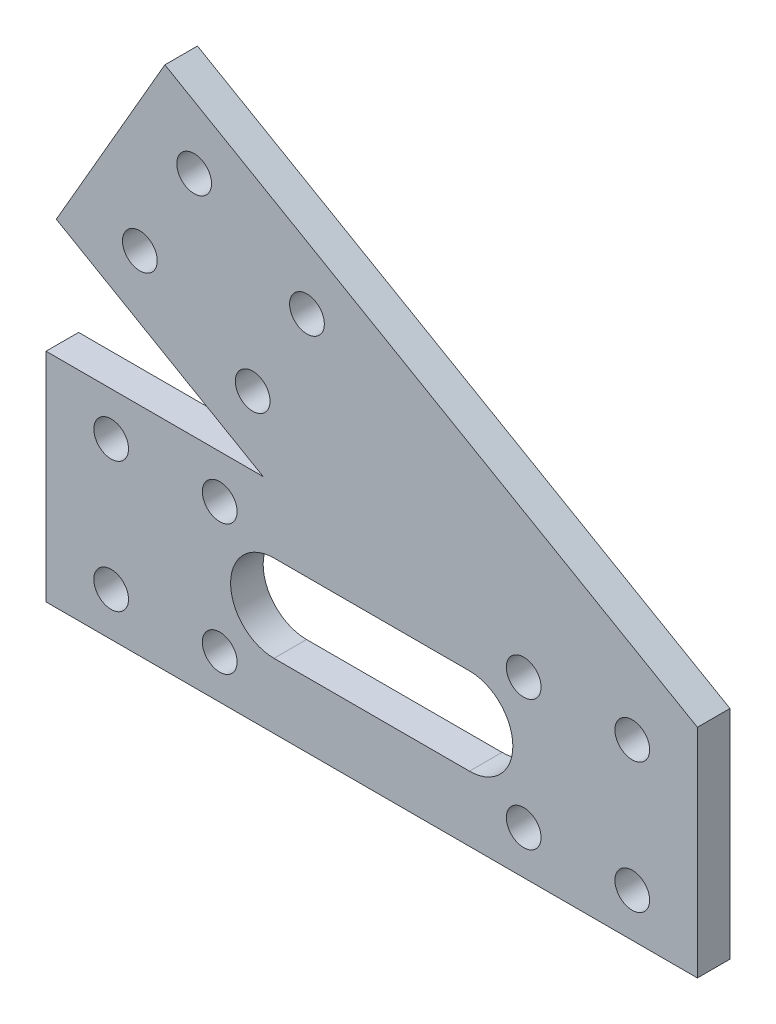
ISO-10303-21;
HEADER;
FILE_DESCRIPTION(('STEP AP214'),'2;1');
FILE_NAME('part.step','',(''),(''),'','','');
FILE_SCHEMA(('AUTOMOTIVE_DESIGN { 1 0 10303 214 1 1 1 1 }'));
ENDSEC;
DATA;
#1=APPLICATION_CONTEXT('core data for automotive mechanical design processes');
#2=APPLICATION_PROTOCOL_DEFINITION('international standard','automotive_design',2000,#1);
#3=PRODUCT_CONTEXT('',#1,'mechanical');
#4=PRODUCT('Part','Part','',(#3));
#5=PRODUCT_RELATED_PRODUCT_CATEGORY('part','',(#4));
#6=PRODUCT_DEFINITION_FORMATION('','',#4);
#7=PRODUCT_DEFINITION_CONTEXT('part definition',#1,'design');
#8=PRODUCT_DEFINITION('design','',#6,#7);
#9=PRODUCT_DEFINITION_SHAPE('','',#8);
#10=(LENGTH_UNIT() NAMED_UNIT(*) SI_UNIT(.MILLI.,.METRE.));
#11=(NAMED_UNIT(*) PLANE_ANGLE_UNIT() SI_UNIT($,.RADIAN.));
#12=(NAMED_UNIT(*) SI_UNIT($,.STERADIAN.) SOLID_ANGLE_UNIT());
#13=UNCERTAINTY_MEASURE_WITH_UNIT(LENGTH_MEASURE(1.E-05),#10,'distance_accuracy_value','');
#14=(GEOMETRIC_REPRESENTATION_CONTEXT(3) GLOBAL_UNCERTAINTY_ASSIGNED_CONTEXT((#13)) GLOBAL_UNIT_ASSIGNED_CONTEXT((#10,
#11,#12)) REPRESENTATION_CONTEXT('',''));
#15=CARTESIAN_POINT('',(0.,0.,0.));
#16=DIRECTION('',(0.,0.,1.));
#17=DIRECTION('',(1.,0.,0.));
#18=AXIS2_PLACEMENT_3D('',#15,#16,#17);
#19=CARTESIAN_POINT('',(60.,20.,3.));
#20=DIRECTION('',(-1.,0.,0.));
#21=DIRECTION('',(0.,0.,1.));
#22=AXIS2_PLACEMENT_3D('',#19,#20,#21);
#23=PLANE('',#22);
#24=DIRECTION('',(0.,1.,0.));
#25=VECTOR('',#24,1.);
#26=CARTESIAN_POINT('',(60.,20.,0.));
#27=LINE('',#26,#25);
#28=CARTESIAN_POINT('',(60.,0.,0.));
#29=VERTEX_POINT('',#28);
#30=CARTESIAN_POINT('',(60.,20.,0.));
#31=VERTEX_POINT('',#30);
#32=EDGE_CURVE('E195',#29,#31,#27,.T.);
#33=ORIENTED_EDGE('',*,*,#32,.T.);
#34=DIRECTION('',(0.,0.,-1.));
#35=VECTOR('',#34,1.);
#36=CARTESIAN_POINT('',(60.,20.,3.));
#37=LINE('',#36,#35);
#38=CARTESIAN_POINT('',(60.,20.,3.));
#39=VERTEX_POINT('',#38);
#40=EDGE_CURVE('E226',#39,#31,#37,.T.);
#41=ORIENTED_EDGE('',*,*,#40,.F.);
#42=DIRECTION('',(0.,1.,0.));
#43=VECTOR('',#42,1.);
#44=CARTESIAN_POINT('',(60.,20.,3.));
#45=LINE('',#44,#43);
#46=CARTESIAN_POINT('',(60.,0.,3.));
#47=VERTEX_POINT('',#46);
#48=EDGE_CURVE('E178',#47,#39,#45,.T.);
#49=ORIENTED_EDGE('',*,*,#48,.F.);
#50=DIRECTION('',(0.,0.,-1.));
#51=VECTOR('',#50,1.);
#52=CARTESIAN_POINT('',(60.,0.,3.));
#53=LINE('',#52,#51);
#54=EDGE_CURVE('E194',#47,#29,#53,.T.);
#55=ORIENTED_EDGE('',*,*,#54,.T.);
#56=EDGE_LOOP('',(#33,#41,#49,#55));
#57=FACE_BOUND('',#56,.T.);
#58=ADVANCED_FACE('F35',(#57),#23,.F.);
#59=CARTESIAN_POINT('',(10.9474411167429,48.3205080756887,3.));
#60=DIRECTION('',(-0.500000000000003,-0.866025403784437,0.));
#61=DIRECTION('',(0.866025403784437,-0.500000000000003,0.));
#62=AXIS2_PLACEMENT_3D('',#59,#60,#61);
#63=PLANE('',#62);
#64=DIRECTION('',(-0.866025403784437,0.500000000000003,0.));
#65=VECTOR('',#64,1.);
#66=CARTESIAN_POINT('',(10.9474411167429,48.3205080756887,0.));
#67=LINE('',#66,#65);
#68=CARTESIAN_POINT('',(10.9474411167429,48.3205080756887,0.));
#69=VERTEX_POINT('',#68);
#70=EDGE_CURVE('E198',#31,#69,#67,.T.);
#71=ORIENTED_EDGE('',*,*,#70,.T.);
#72=DIRECTION('',(0.,0.,-1.));
#73=VECTOR('',#72,1.);
#74=CARTESIAN_POINT('',(10.9474411167429,48.3205080756887,3.));
#75=LINE('',#74,#73);
#76=CARTESIAN_POINT('',(10.9474411167429,48.3205080756887,3.));
#77=VERTEX_POINT('',#76);
#78=EDGE_CURVE('E223',#77,#69,#75,.T.);
#79=ORIENTED_EDGE('',*,*,#78,.F.);
#80=DIRECTION('',(-0.866025403784437,0.500000000000003,0.));
#81=VECTOR('',#80,1.);
#82=CARTESIAN_POINT('',(10.9474411167429,48.3205080756887,3.));
#83=LINE('',#82,#81);
#84=EDGE_CURVE('E181',#39,#77,#83,.T.);
#85=ORIENTED_EDGE('',*,*,#84,.F.);
#86=ORIENTED_EDGE('',*,*,#40,.T.);
#87=EDGE_LOOP('',(#71,#79,#85,#86));
#88=FACE_BOUND('',#87,.T.);
#89=ADVANCED_FACE('F332',(#88),#63,.F.);
#90=CARTESIAN_POINT('',(0.947441116743004,30.9999999999998,3.));
#91=DIRECTION('',(0.866025403784441,-0.499999999999995,0.));
#92=DIRECTION('',(0.499999999999995,0.866025403784442,0.));
#93=AXIS2_PLACEMENT_3D('',#90,#91,#92);
#94=PLANE('',#93);
#95=DIRECTION('',(-0.499999999999995,-0.866025403784442,0.));
#96=VECTOR('',#95,1.);
#97=CARTESIAN_POINT('',(0.947441116743004,30.9999999999998,0.));
#98=LINE('',#97,#96);
#99=CARTESIAN_POINT('',(0.947441116743004,30.9999999999998,0.));
#100=VERTEX_POINT('',#99);
#101=EDGE_CURVE('E200',#69,#100,#98,.T.);
#102=ORIENTED_EDGE('',*,*,#101,.T.);
#103=DIRECTION('',(0.,0.,-1.));
#104=VECTOR('',#103,1.);
#105=CARTESIAN_POINT('',(0.947441116743004,30.9999999999998,3.));
#106=LINE('',#105,#104);
#107=CARTESIAN_POINT('',(0.947441116743004,30.9999999999998,3.));
#108=VERTEX_POINT('',#107);
#109=EDGE_CURVE('E220',#108,#100,#106,.T.);
#110=ORIENTED_EDGE('',*,*,#109,.F.);
#111=DIRECTION('',(-0.499999999999995,-0.866025403784442,0.));
#112=VECTOR('',#111,1.);
#113=CARTESIAN_POINT('',(0.947441116743004,30.9999999999998,3.));
#114=LINE('',#113,#112);
#115=EDGE_CURVE('E184',#77,#108,#114,.T.);
#116=ORIENTED_EDGE('',*,*,#115,.F.);
#117=ORIENTED_EDGE('',*,*,#78,.T.);
#118=EDGE_LOOP('',(#102,#110,#116,#117));
#119=FACE_BOUND('',#118,.T.);
#120=ADVANCED_FACE('F329',(#119),#94,.F.);
#121=CARTESIAN_POINT('',(20.0000000000007,19.9999999999999,3.));
#122=DIRECTION('',(0.499999999999995,0.866025403784441,0.));
#123=DIRECTION('',(-0.866025403784442,0.499999999999995,0.));
#124=AXIS2_PLACEMENT_3D('',#121,#122,#123);
#125=PLANE('',#124);
#126=DIRECTION('',(0.866025403784442,-0.499999999999995,0.));
#127=VECTOR('',#126,1.);
#128=CARTESIAN_POINT('',(20.0000000000007,19.9999999999999,0.));
#129=LINE('',#128,#127);
#130=CARTESIAN_POINT('',(20.0000000000007,19.9999999999999,0.));
#131=VERTEX_POINT('',#130);
#132=EDGE_CURVE('E202',#100,#131,#129,.T.);
#133=ORIENTED_EDGE('',*,*,#132,.T.);
#134=DIRECTION('',(0.,0.,-1.));
#135=VECTOR('',#134,1.);
#136=CARTESIAN_POINT('',(20.0000000000007,19.9999999999999,3.));
#137=LINE('',#136,#135);
#138=CARTESIAN_POINT('',(20.0000000000007,19.9999999999999,3.));
#139=VERTEX_POINT('',#138);
#140=EDGE_CURVE('E217',#139,#131,#137,.T.);
#141=ORIENTED_EDGE('',*,*,#140,.F.);
#142=DIRECTION('',(0.866025403784442,-0.499999999999995,0.));
#143=VECTOR('',#142,1.);
#144=CARTESIAN_POINT('',(20.0000000000007,19.9999999999999,3.));
#145=LINE('',#144,#143);
#146=EDGE_CURVE('E186',#108,#139,#145,.T.);
#147=ORIENTED_EDGE('',*,*,#146,.F.);
#148=ORIENTED_EDGE('',*,*,#109,.T.);
#149=EDGE_LOOP('',(#133,#141,#147,#148));
#150=FACE_BOUND('',#149,.T.);
#151=ADVANCED_FACE('F325',(#150),#125,.F.);
#152=CARTESIAN_POINT('',(20.0000000000007,19.9999999999999,3.));
#153=DIRECTION('',(0.,-1.,0.));
#154=DIRECTION('',(1.,0.,0.));
#155=AXIS2_PLACEMENT_3D('',#152,#153,#154);
#156=PLANE('',#155);
#157=DIRECTION('',(-1.,0.,0.));
#158=VECTOR('',#157,1.);
#159=CARTESIAN_POINT('',(20.0000000000007,19.9999999999999,0.));
#160=LINE('',#159,#158);
#161=CARTESIAN_POINT('',(0.,20.,0.));
#162=VERTEX_POINT('',#161);
#163=EDGE_CURVE('E204',#131,#162,#160,.T.);
#164=ORIENTED_EDGE('',*,*,#163,.T.);
#165=DIRECTION('',(0.,0.,-1.));
#166=VECTOR('',#165,1.);
#167=CARTESIAN_POINT('',(0.,20.,3.));
#168=LINE('',#167,#166);
#169=CARTESIAN_POINT('',(0.,20.,3.));
#170=VERTEX_POINT('',#169);
#171=EDGE_CURVE('E214',#170,#162,#168,.T.);
#172=ORIENTED_EDGE('',*,*,#171,.F.);
#173=DIRECTION('',(-1.,0.,0.));
#174=VECTOR('',#173,1.);
#175=CARTESIAN_POINT('',(20.0000000000007,19.9999999999999,3.));
#176=LINE('',#175,#174);
#177=EDGE_CURVE('E188',#139,#170,#176,.T.);
#178=ORIENTED_EDGE('',*,*,#177,.F.);
#179=ORIENTED_EDGE('',*,*,#140,.T.);
#180=EDGE_LOOP('',(#164,#172,#178,#179));
#181=FACE_BOUND('',#180,.T.);
#182=ADVANCED_FACE('F320',(#181),#156,.F.);
#183=CARTESIAN_POINT('',(0.,0.,3.));
#184=DIRECTION('',(1.,0.,0.));
#185=DIRECTION('',(0.,0.,-1.));
#186=AXIS2_PLACEMENT_3D('',#183,#184,#185);
#187=PLANE('',#186);
#188=DIRECTION('',(0.,-1.,0.));
#189=VECTOR('',#188,1.);
#190=CARTESIAN_POINT('',(0.,0.,0.));
#191=LINE('',#190,#189);
#192=CARTESIAN_POINT('',(0.,0.,0.));
#193=VERTEX_POINT('',#192);
#194=EDGE_CURVE('E206',#162,#193,#191,.T.);
#195=ORIENTED_EDGE('',*,*,#194,.T.);
#196=DIRECTION('',(0.,0.,-1.));
#197=VECTOR('',#196,1.);
#198=CARTESIAN_POINT('',(0.,0.,3.));
#199=LINE('',#198,#197);
#200=CARTESIAN_POINT('',(0.,0.,3.));
#201=VERTEX_POINT('',#200);
#202=EDGE_CURVE('E211',#201,#193,#199,.T.);
#203=ORIENTED_EDGE('',*,*,#202,.F.);
#204=DIRECTION('',(0.,-1.,0.));
#205=VECTOR('',#204,1.);
#206=CARTESIAN_POINT('',(0.,0.,3.));
#207=LINE('',#206,#205);
#208=EDGE_CURVE('E190',#170,#201,#207,.T.);
#209=ORIENTED_EDGE('',*,*,#208,.F.);
#210=ORIENTED_EDGE('',*,*,#171,.T.);
#211=EDGE_LOOP('',(#195,#203,#209,#210));
#212=FACE_BOUND('',#211,.T.);
#213=ADVANCED_FACE('F315',(#212),#187,.F.);
#214=CARTESIAN_POINT('',(60.,0.,3.));
#215=DIRECTION('',(0.,1.,0.));
#216=DIRECTION('',(-1.,0.,0.));
#217=AXIS2_PLACEMENT_3D('',#214,#215,#216);
#218=PLANE('',#217);
#219=DIRECTION('',(1.,0.,0.));
#220=VECTOR('',#219,1.);
#221=CARTESIAN_POINT('',(60.,0.,0.));
#222=LINE('',#221,#220);
#223=EDGE_CURVE('E182',#193,#29,#222,.T.);
#224=ORIENTED_EDGE('',*,*,#223,.T.);
#225=ORIENTED_EDGE('',*,*,#54,.F.);
#226=DIRECTION('',(1.,0.,0.));
#227=VECTOR('',#226,1.);
#228=CARTESIAN_POINT('',(60.,0.,3.));
#229=LINE('',#228,#227);
#230=EDGE_CURVE('E192',#201,#47,#229,.T.);
#231=ORIENTED_EDGE('',*,*,#230,.F.);
#232=ORIENTED_EDGE('',*,*,#202,.T.);
#233=EDGE_LOOP('',(#224,#225,#231,#232));
#234=FACE_BOUND('',#233,.T.);
#235=ADVANCED_FACE('F311',(#234),#218,.F.);
#236=CARTESIAN_POINT('',(0.,0.,3.));
#237=DIRECTION('',(0.,0.,-1.));
#238=DIRECTION('',(-1.,0.,0.));
#239=AXIS2_PLACEMENT_3D('',#236,#237,#238);
#240=PLANE('',#239);
#241=CARTESIAN_POINT('',(13.6435935394494,40.9903810567663,3.));
#242=DIRECTION('',(0.,0.,1.));
#243=DIRECTION('',(1.,0.,0.));
#244=AXIS2_PLACEMENT_3D('',#241,#242,#243);
#245=CIRCLE('',#244,1.6);
#246=CARTESIAN_POINT('',(15.2435935394494,40.9903810567663,3.));
#247=VERTEX_POINT('',#246);
#248=EDGE_CURVE('E169',#247,#247,#245,.T.);
#249=ORIENTED_EDGE('',*,*,#248,.F.);
#250=EDGE_LOOP('',(#249));
#251=FACE_BOUND('',#250,.T.);
#252=CARTESIAN_POINT('',(16.,3.99999999999991,3.));
#253=DIRECTION('',(0.,0.,1.));
#254=DIRECTION('',(1.,0.,0.));
#255=AXIS2_PLACEMENT_3D('',#252,#253,#254);
#256=CIRCLE('',#255,1.6);
#257=CARTESIAN_POINT('',(17.6,3.99999999999991,3.));
#258=VERTEX_POINT('',#257);
#259=EDGE_CURVE('E147',#258,#258,#256,.T.);
#260=ORIENTED_EDGE('',*,*,#259,.F.);
#261=EDGE_LOOP('',(#260));
#262=FACE_BOUND('',#261,.T.);
#263=CARTESIAN_POINT('',(44.,15.9999999999999,3.));
#264=DIRECTION('',(0.,0.,1.));
#265=DIRECTION('',(1.,0.,0.));
#266=AXIS2_PLACEMENT_3D('',#263,#264,#265);
#267=CIRCLE('',#266,1.6);
#268=CARTESIAN_POINT('',(45.6,15.9999999999999,3.));
#269=VERTEX_POINT('',#268);
#270=EDGE_CURVE('E151',#269,#269,#267,.T.);
#271=ORIENTED_EDGE('',*,*,#270,.F.);
#272=EDGE_LOOP('',(#271));
#273=FACE_BOUND('',#272,.T.);
#274=CARTESIAN_POINT('',(44.,3.99999999999991,3.));
#275=DIRECTION('',(0.,0.,1.));
#276=DIRECTION('',(1.,0.,0.));
#277=AXIS2_PLACEMENT_3D('',#274,#275,#276);
#278=CIRCLE('',#277,1.6);
#279=CARTESIAN_POINT('',(45.6,3.99999999999991,3.));
#280=VERTEX_POINT('',#279);
#281=EDGE_CURVE('E144',#280,#280,#278,.T.);
#282=ORIENTED_EDGE('',*,*,#281,.F.);
#283=EDGE_LOOP('',(#282));
#284=FACE_BOUND('',#283,.T.);
#285=DIRECTION('',(1.,0.,0.));
#286=VECTOR('',#285,1.);
#287=CARTESIAN_POINT('',(21.,5.99999999999991,3.));
#288=LINE('',#287,#286);
#289=CARTESIAN_POINT('',(21.,5.99999999999991,3.));
#290=VERTEX_POINT('',#289);
#291=CARTESIAN_POINT('',(39.,5.99999999999991,3.));
#292=VERTEX_POINT('',#291);
#293=EDGE_CURVE('E130',#290,#292,#288,.T.);
#294=ORIENTED_EDGE('',*,*,#293,.F.);
#295=CARTESIAN_POINT('',(21.,9.99999999999991,3.));
#296=DIRECTION('',(0.,0.,1.));
#297=DIRECTION('',(1.,0.,0.));
#298=AXIS2_PLACEMENT_3D('',#295,#296,#297);
#299=CIRCLE('',#298,4.);
#300=CARTESIAN_POINT('',(21.,13.9999999999999,3.));
#301=VERTEX_POINT('',#300);
#302=EDGE_CURVE('E51',#301,#290,#299,.T.);
#303=ORIENTED_EDGE('',*,*,#302,.F.);
#304=DIRECTION('',(-1.,0.,0.));
#305=VECTOR('',#304,1.);
#306=CARTESIAN_POINT('',(21.,13.9999999999999,3.));
#307=LINE('',#306,#305);
#308=CARTESIAN_POINT('',(39.,13.9999999999999,3.));
#309=VERTEX_POINT('',#308);
#310=EDGE_CURVE('E137',#309,#301,#307,.T.);
#311=ORIENTED_EDGE('',*,*,#310,.F.);
#312=CARTESIAN_POINT('',(39.,9.99999999999991,3.));
#313=DIRECTION('',(0.,0.,1.));
#314=DIRECTION('',(1.,0.,0.));
#315=AXIS2_PLACEMENT_3D('',#312,#313,#314);
#316=CIRCLE('',#315,4.);
#317=EDGE_CURVE('E121',#292,#309,#316,.T.);
#318=ORIENTED_EDGE('',*,*,#317,.F.);
#319=EDGE_LOOP('',(#294,#303,#311,#318));
#320=FACE_BOUND('',#319,.T.);
#321=CARTESIAN_POINT('',(8.64359353944945,32.3301270189219,3.));
#322=DIRECTION('',(0.,0.,1.));
#323=DIRECTION('',(1.,0.,0.));
#324=AXIS2_PLACEMENT_3D('',#321,#322,#323);
#325=CIRCLE('',#324,1.6);
#326=CARTESIAN_POINT('',(10.2435935394495,32.3301270189219,3.));
#327=VERTEX_POINT('',#326);
#328=EDGE_CURVE('E166',#327,#327,#325,.T.);
#329=ORIENTED_EDGE('',*,*,#328,.F.);
#330=EDGE_LOOP('',(#329));
#331=FACE_BOUND('',#330,.T.);
#332=CARTESIAN_POINT('',(24.0358983848627,34.9903810567663,3.));
#333=DIRECTION('',(0.,0.,1.));
#334=DIRECTION('',(1.,0.,0.));
#335=AXIS2_PLACEMENT_3D('',#332,#333,#334);
#336=CIRCLE('',#335,1.6);
#337=CARTESIAN_POINT('',(25.6358983848627,34.9903810567663,3.));
#338=VERTEX_POINT('',#337);
#339=EDGE_CURVE('E170',#338,#338,#336,.T.);
#340=ORIENTED_EDGE('',*,*,#339,.F.);
#341=EDGE_LOOP('',(#340));
#342=FACE_BOUND('',#341,.T.);
#343=CARTESIAN_POINT('',(19.0358983848627,26.3301270189219,3.));
#344=DIRECTION('',(0.,0.,1.));
#345=DIRECTION('',(1.,0.,0.));
#346=AXIS2_PLACEMENT_3D('',#343,#344,#345);
#347=CIRCLE('',#346,1.6);
#348=CARTESIAN_POINT('',(20.6358983848627,26.3301270189219,3.));
#349=VERTEX_POINT('',#348);
#350=EDGE_CURVE('E173',#349,#349,#347,.T.);
#351=ORIENTED_EDGE('',*,*,#350,.F.);
#352=EDGE_LOOP('',(#351));
#353=FACE_BOUND('',#352,.T.);
#354=CARTESIAN_POINT('',(6.,15.9999999999999,3.));
#355=DIRECTION('',(0.,0.,1.));
#356=DIRECTION('',(1.,0.,0.));
#357=AXIS2_PLACEMENT_3D('',#354,#355,#356);
#358=CIRCLE('',#357,1.6);
#359=CARTESIAN_POINT('',(7.6,15.9999999999999,3.));
#360=VERTEX_POINT('',#359);
#361=EDGE_CURVE('E163',#360,#360,#358,.T.);
#362=ORIENTED_EDGE('',*,*,#361,.F.);
#363=EDGE_LOOP('',(#362));
#364=FACE_BOUND('',#363,.T.);
#365=CARTESIAN_POINT('',(16.,15.9999999999999,3.));
#366=DIRECTION('',(0.,0.,1.));
#367=DIRECTION('',(1.,0.,0.));
#368=AXIS2_PLACEMENT_3D('',#365,#366,#367);
#369=CIRCLE('',#368,1.6);
#370=CARTESIAN_POINT('',(17.6,15.9999999999999,3.));
#371=VERTEX_POINT('',#370);
#372=EDGE_CURVE('E150',#371,#371,#369,.T.);
#373=ORIENTED_EDGE('',*,*,#372,.F.);
#374=EDGE_LOOP('',(#373));
#375=FACE_BOUND('',#374,.T.);
#376=CARTESIAN_POINT('',(54.,3.99999999999991,3.));
#377=DIRECTION('',(0.,0.,1.));
#378=DIRECTION('',(1.,0.,0.));
#379=AXIS2_PLACEMENT_3D('',#376,#377,#378);
#380=CIRCLE('',#379,1.6);
#381=CARTESIAN_POINT('',(55.6,3.99999999999991,3.));
#382=VERTEX_POINT('',#381);
#383=EDGE_CURVE('E154',#382,#382,#380,.T.);
#384=ORIENTED_EDGE('',*,*,#383,.F.);
#385=EDGE_LOOP('',(#384));
#386=FACE_BOUND('',#385,.T.);
#387=CARTESIAN_POINT('',(54.,15.9999999999999,3.));
#388=DIRECTION('',(0.,0.,1.));
#389=DIRECTION('',(1.,0.,0.));
#390=AXIS2_PLACEMENT_3D('',#387,#388,#389);
#391=CIRCLE('',#390,1.6);
#392=CARTESIAN_POINT('',(55.6,15.9999999999999,3.));
#393=VERTEX_POINT('',#392);
#394=EDGE_CURVE('E157',#393,#393,#391,.T.);
#395=ORIENTED_EDGE('',*,*,#394,.F.);
#396=EDGE_LOOP('',(#395));
#397=FACE_BOUND('',#396,.T.);
#398=CARTESIAN_POINT('',(6.,3.99999999999991,3.));
#399=DIRECTION('',(0.,0.,1.));
#400=DIRECTION('',(1.,0.,0.));
#401=AXIS2_PLACEMENT_3D('',#398,#399,#400);
#402=CIRCLE('',#401,1.6);
#403=CARTESIAN_POINT('',(7.6,3.99999999999991,3.));
#404=VERTEX_POINT('',#403);
#405=EDGE_CURVE('E160',#404,#404,#402,.T.);
#406=ORIENTED_EDGE('',*,*,#405,.F.);
#407=EDGE_LOOP('',(#406));
#408=FACE_BOUND('',#407,.T.);
#409=ORIENTED_EDGE('',*,*,#48,.T.);
#410=ORIENTED_EDGE('',*,*,#84,.T.);
#411=ORIENTED_EDGE('',*,*,#115,.T.);
#412=ORIENTED_EDGE('',*,*,#146,.T.);
#413=ORIENTED_EDGE('',*,*,#177,.T.);
#414=ORIENTED_EDGE('',*,*,#208,.T.);
#415=ORIENTED_EDGE('',*,*,#230,.T.);
#416=EDGE_LOOP('',(#409,#410,#411,#412,#413,#414,#415));
#417=FACE_BOUND('',#416,.T.);
#418=ADVANCED_FACE('F134',(#251,#262,#273,#284,#320,#331,#342,#353,#364,#375,#386,#397,#408,
#417),#240,.F.);
#419=CARTESIAN_POINT('',(0.,0.,0.));
#420=DIRECTION('',(0.,0.,-1.));
#421=DIRECTION('',(-1.,0.,0.));
#422=AXIS2_PLACEMENT_3D('',#419,#420,#421);
#423=PLANE('',#422);
#424=CARTESIAN_POINT('',(13.6435935394494,40.9903810567663,0.));
#425=DIRECTION('',(0.,0.,-1.));
#426=DIRECTION('',(-1.,0.,0.));
#427=AXIS2_PLACEMENT_3D('',#424,#425,#426);
#428=CIRCLE('',#427,1.6);
#429=CARTESIAN_POINT('',(12.0435935394494,40.9903810567663,0.));
#430=VERTEX_POINT('',#429);
#431=EDGE_CURVE('E38',#430,#430,#428,.T.);
#432=ORIENTED_EDGE('',*,*,#431,.F.);
#433=EDGE_LOOP('',(#432));
#434=FACE_BOUND('',#433,.T.);
#435=CARTESIAN_POINT('',(16.,3.99999999999991,0.));
#436=DIRECTION('',(0.,0.,-1.));
#437=DIRECTION('',(-1.,0.,0.));
#438=AXIS2_PLACEMENT_3D('',#435,#436,#437);
#439=CIRCLE('',#438,1.6);
#440=CARTESIAN_POINT('',(14.4,3.99999999999991,0.));
#441=VERTEX_POINT('',#440);
#442=EDGE_CURVE('E262',#441,#441,#439,.T.);
#443=ORIENTED_EDGE('',*,*,#442,.F.);
#444=EDGE_LOOP('',(#443));
#445=FACE_BOUND('',#444,.T.);
#446=CARTESIAN_POINT('',(44.,15.9999999999999,0.));
#447=DIRECTION('',(0.,0.,-1.));
#448=DIRECTION('',(-1.,0.,0.));
#449=AXIS2_PLACEMENT_3D('',#446,#447,#448);
#450=CIRCLE('',#449,1.6);
#451=CARTESIAN_POINT('',(42.4,15.9999999999999,0.));
#452=VERTEX_POINT('',#451);
#453=EDGE_CURVE('E260',#452,#452,#450,.T.);
#454=ORIENTED_EDGE('',*,*,#453,.F.);
#455=EDGE_LOOP('',(#454));
#456=FACE_BOUND('',#455,.T.);
#457=CARTESIAN_POINT('',(44.,3.99999999999991,0.));
#458=DIRECTION('',(0.,0.,-1.));
#459=DIRECTION('',(-1.,0.,0.));
#460=AXIS2_PLACEMENT_3D('',#457,#458,#459);
#461=CIRCLE('',#460,1.6);
#462=CARTESIAN_POINT('',(42.4,3.99999999999991,0.));
#463=VERTEX_POINT('',#462);
#464=EDGE_CURVE('E254',#463,#463,#461,.T.);
#465=ORIENTED_EDGE('',*,*,#464,.F.);
#466=EDGE_LOOP('',(#465));
#467=FACE_BOUND('',#466,.T.);
#468=CARTESIAN_POINT('',(21.,9.99999999999991,0.));
#469=DIRECTION('',(0.,0.,-1.));
#470=DIRECTION('',(-1.,0.,0.));
#471=AXIS2_PLACEMENT_3D('',#468,#469,#470);
#472=CIRCLE('',#471,4.);
#473=CARTESIAN_POINT('',(21.,5.99999999999991,0.));
#474=VERTEX_POINT('',#473);
#475=CARTESIAN_POINT('',(21.,13.9999999999999,0.));
#476=VERTEX_POINT('',#475);
#477=EDGE_CURVE('E11',#474,#476,#472,.T.);
#478=ORIENTED_EDGE('',*,*,#477,.F.);
#479=DIRECTION('',(-1.,0.,0.));
#480=VECTOR('',#479,1.);
#481=CARTESIAN_POINT('',(0.,5.9999999999999,0.));
#482=LINE('',#481,#480);
#483=CARTESIAN_POINT('',(39.,5.99999999999991,0.));
#484=VERTEX_POINT('',#483);
#485=EDGE_CURVE('E229',#484,#474,#482,.T.);
#486=ORIENTED_EDGE('',*,*,#485,.F.);
#487=CARTESIAN_POINT('',(39.,9.99999999999991,0.));
#488=DIRECTION('',(0.,0.,-1.));
#489=DIRECTION('',(-1.,0.,0.));
#490=AXIS2_PLACEMENT_3D('',#487,#488,#489);
#491=CIRCLE('',#490,4.);
#492=CARTESIAN_POINT('',(39.,13.9999999999999,0.));
#493=VERTEX_POINT('',#492);
#494=EDGE_CURVE('E124',#493,#484,#491,.T.);
#495=ORIENTED_EDGE('',*,*,#494,.F.);
#496=DIRECTION('',(1.,0.,0.));
#497=VECTOR('',#496,1.);
#498=CARTESIAN_POINT('',(0.,13.9999999999999,0.));
#499=LINE('',#498,#497);
#500=EDGE_CURVE('E43',#476,#493,#499,.T.);
#501=ORIENTED_EDGE('',*,*,#500,.F.);
#502=EDGE_LOOP('',(#478,#486,#495,#501));
#503=FACE_BOUND('',#502,.T.);
#504=CARTESIAN_POINT('',(8.64359353944945,32.3301270189219,0.));
#505=DIRECTION('',(0.,0.,-1.));
#506=DIRECTION('',(-1.,0.,0.));
#507=AXIS2_PLACEMENT_3D('',#504,#505,#506);
#508=CIRCLE('',#507,1.6);
#509=CARTESIAN_POINT('',(7.04359353944945,32.3301270189219,0.));
#510=VERTEX_POINT('',#509);
#511=EDGE_CURVE('E251',#510,#510,#508,.T.);
#512=ORIENTED_EDGE('',*,*,#511,.F.);
#513=EDGE_LOOP('',(#512));
#514=FACE_BOUND('',#513,.T.);
#515=CARTESIAN_POINT('',(24.0358983848627,34.9903810567663,0.));
#516=DIRECTION('',(0.,0.,-1.));
#517=DIRECTION('',(-1.,0.,0.));
#518=AXIS2_PLACEMENT_3D('',#515,#516,#517);
#519=CIRCLE('',#518,1.6);
#520=CARTESIAN_POINT('',(22.4358983848627,34.9903810567663,0.));
#521=VERTEX_POINT('',#520);
#522=EDGE_CURVE('E248',#521,#521,#519,.T.);
#523=ORIENTED_EDGE('',*,*,#522,.F.);
#524=EDGE_LOOP('',(#523));
#525=FACE_BOUND('',#524,.T.);
#526=CARTESIAN_POINT('',(19.0358983848627,26.3301270189219,0.));
#527=DIRECTION('',(0.,0.,-1.));
#528=DIRECTION('',(-1.,0.,0.));
#529=AXIS2_PLACEMENT_3D('',#526,#527,#528);
#530=CIRCLE('',#529,1.6);
#531=CARTESIAN_POINT('',(17.4358983848627,26.3301270189219,0.));
#532=VERTEX_POINT('',#531);
#533=EDGE_CURVE('E245',#532,#532,#530,.T.);
#534=ORIENTED_EDGE('',*,*,#533,.F.);
#535=EDGE_LOOP('',(#534));
#536=FACE_BOUND('',#535,.T.);
#537=CARTESIAN_POINT('',(6.,15.9999999999999,0.));
#538=DIRECTION('',(0.,0.,-1.));
#539=DIRECTION('',(-1.,0.,0.));
#540=AXIS2_PLACEMENT_3D('',#537,#538,#539);
#541=CIRCLE('',#540,1.6);
#542=CARTESIAN_POINT('',(4.4,15.9999999999999,0.));
#543=VERTEX_POINT('',#542);
#544=EDGE_CURVE('E242',#543,#543,#541,.T.);
#545=ORIENTED_EDGE('',*,*,#544,.F.);
#546=EDGE_LOOP('',(#545));
#547=FACE_BOUND('',#546,.T.);
#548=CARTESIAN_POINT('',(16.,15.9999999999999,0.));
#549=DIRECTION('',(0.,0.,-1.));
#550=DIRECTION('',(-1.,0.,0.));
#551=AXIS2_PLACEMENT_3D('',#548,#549,#550);
#552=CIRCLE('',#551,1.6);
#553=CARTESIAN_POINT('',(14.4,15.9999999999999,0.));
#554=VERTEX_POINT('',#553);
#555=EDGE_CURVE('E239',#554,#554,#552,.T.);
#556=ORIENTED_EDGE('',*,*,#555,.F.);
#557=EDGE_LOOP('',(#556));
#558=FACE_BOUND('',#557,.T.);
#559=CARTESIAN_POINT('',(54.,3.99999999999991,0.));
#560=DIRECTION('',(0.,0.,-1.));
#561=DIRECTION('',(-1.,0.,0.));
#562=AXIS2_PLACEMENT_3D('',#559,#560,#561);
#563=CIRCLE('',#562,1.6);
#564=CARTESIAN_POINT('',(52.4,3.99999999999991,0.));
#565=VERTEX_POINT('',#564);
#566=EDGE_CURVE('E236',#565,#565,#563,.T.);
#567=ORIENTED_EDGE('',*,*,#566,.F.);
#568=EDGE_LOOP('',(#567));
#569=FACE_BOUND('',#568,.T.);
#570=CARTESIAN_POINT('',(54.,15.9999999999999,0.));
#571=DIRECTION('',(0.,0.,-1.));
#572=DIRECTION('',(-1.,0.,0.));
#573=AXIS2_PLACEMENT_3D('',#570,#571,#572);
#574=CIRCLE('',#573,1.6);
#575=CARTESIAN_POINT('',(52.4,15.9999999999999,0.));
#576=VERTEX_POINT('',#575);
#577=EDGE_CURVE('E233',#576,#576,#574,.T.);
#578=ORIENTED_EDGE('',*,*,#577,.F.);
#579=EDGE_LOOP('',(#578));
#580=FACE_BOUND('',#579,.T.);
#581=CARTESIAN_POINT('',(6.,3.99999999999991,0.));
#582=DIRECTION('',(0.,0.,-1.));
#583=DIRECTION('',(-1.,0.,0.));
#584=AXIS2_PLACEMENT_3D('',#581,#582,#583);
#585=CIRCLE('',#584,1.6);
#586=CARTESIAN_POINT('',(4.4,3.99999999999991,0.));
#587=VERTEX_POINT('',#586);
#588=EDGE_CURVE('E230',#587,#587,#585,.T.);
#589=ORIENTED_EDGE('',*,*,#588,.F.);
#590=EDGE_LOOP('',(#589));
#591=FACE_BOUND('',#590,.T.);
#592=ORIENTED_EDGE('',*,*,#32,.F.);
#593=ORIENTED_EDGE('',*,*,#223,.F.);
#594=ORIENTED_EDGE('',*,*,#194,.F.);
#595=ORIENTED_EDGE('',*,*,#163,.F.);
#596=ORIENTED_EDGE('',*,*,#132,.F.);
#597=ORIENTED_EDGE('',*,*,#101,.F.);
#598=ORIENTED_EDGE('',*,*,#70,.F.);
#599=EDGE_LOOP('',(#592,#593,#594,#595,#596,#597,#598));
#600=FACE_BOUND('',#599,.T.);
#601=ADVANCED_FACE('F272',(#434,#445,#456,#467,#503,#514,#525,#536,#547,#558,#569,#580,#591,
#600),#423,.T.);
#602=CARTESIAN_POINT('',(6.,3.99999999999991,-7.));
#603=DIRECTION('',(0.,0.,1.));
#604=DIRECTION('',(1.,0.,0.));
#605=AXIS2_PLACEMENT_3D('',#602,#603,#604);
#606=CYLINDRICAL_SURFACE('',#605,1.6);
#607=ORIENTED_EDGE('',*,*,#588,.T.);
#608=EDGE_LOOP('',(#607));
#609=FACE_BOUND('',#608,.T.);
#610=ORIENTED_EDGE('',*,*,#405,.T.);
#611=EDGE_LOOP('',(#610));
#612=FACE_BOUND('',#611,.T.);
#613=ADVANCED_FACE('F275',(#609,#612),#606,.F.);
#614=CARTESIAN_POINT('',(54.,15.9999999999999,-7.));
#615=DIRECTION('',(0.,0.,1.));
#616=DIRECTION('',(1.,0.,0.));
#617=AXIS2_PLACEMENT_3D('',#614,#615,#616);
#618=CYLINDRICAL_SURFACE('',#617,1.6);
#619=ORIENTED_EDGE('',*,*,#577,.T.);
#620=EDGE_LOOP('',(#619));
#621=FACE_BOUND('',#620,.T.);
#622=ORIENTED_EDGE('',*,*,#394,.T.);
#623=EDGE_LOOP('',(#622));
#624=FACE_BOUND('',#623,.T.);
#625=ADVANCED_FACE('F385',(#621,#624),#618,.F.);
#626=CARTESIAN_POINT('',(54.,3.99999999999991,-7.));
#627=DIRECTION('',(0.,0.,1.));
#628=DIRECTION('',(1.,0.,0.));
#629=AXIS2_PLACEMENT_3D('',#626,#627,#628);
#630=CYLINDRICAL_SURFACE('',#629,1.6);
#631=ORIENTED_EDGE('',*,*,#566,.T.);
#632=EDGE_LOOP('',(#631));
#633=FACE_BOUND('',#632,.T.);
#634=ORIENTED_EDGE('',*,*,#383,.T.);
#635=EDGE_LOOP('',(#634));
#636=FACE_BOUND('',#635,.T.);
#637=ADVANCED_FACE('F395',(#633,#636),#630,.F.);
#638=CARTESIAN_POINT('',(16.,15.9999999999999,-7.));
#639=DIRECTION('',(0.,0.,1.));
#640=DIRECTION('',(1.,0.,0.));
#641=AXIS2_PLACEMENT_3D('',#638,#639,#640);
#642=CYLINDRICAL_SURFACE('',#641,1.6);
#643=ORIENTED_EDGE('',*,*,#555,.T.);
#644=EDGE_LOOP('',(#643));
#645=FACE_BOUND('',#644,.T.);
#646=ORIENTED_EDGE('',*,*,#372,.T.);
#647=EDGE_LOOP('',(#646));
#648=FACE_BOUND('',#647,.T.);
#649=ADVANCED_FACE('F405',(#645,#648),#642,.F.);
#650=CARTESIAN_POINT('',(6.,15.9999999999999,-7.));
#651=DIRECTION('',(0.,0.,1.));
#652=DIRECTION('',(1.,0.,0.));
#653=AXIS2_PLACEMENT_3D('',#650,#651,#652);
#654=CYLINDRICAL_SURFACE('',#653,1.6);
#655=ORIENTED_EDGE('',*,*,#544,.T.);
#656=EDGE_LOOP('',(#655));
#657=FACE_BOUND('',#656,.T.);
#658=ORIENTED_EDGE('',*,*,#361,.T.);
#659=EDGE_LOOP('',(#658));
#660=FACE_BOUND('',#659,.T.);
#661=ADVANCED_FACE('F415',(#657,#660),#654,.F.);
#662=CARTESIAN_POINT('',(19.0358983848627,26.3301270189219,-7.));
#663=DIRECTION('',(0.,0.,1.));
#664=DIRECTION('',(1.,0.,0.));
#665=AXIS2_PLACEMENT_3D('',#662,#663,#664);
#666=CYLINDRICAL_SURFACE('',#665,1.6);
#667=ORIENTED_EDGE('',*,*,#533,.T.);
#668=EDGE_LOOP('',(#667));
#669=FACE_BOUND('',#668,.T.);
#670=ORIENTED_EDGE('',*,*,#350,.T.);
#671=EDGE_LOOP('',(#670));
#672=FACE_BOUND('',#671,.T.);
#673=ADVANCED_FACE('F425',(#669,#672),#666,.F.);
#674=CARTESIAN_POINT('',(24.0358983848627,34.9903810567663,-7.));
#675=DIRECTION('',(0.,0.,1.));
#676=DIRECTION('',(1.,0.,0.));
#677=AXIS2_PLACEMENT_3D('',#674,#675,#676);
#678=CYLINDRICAL_SURFACE('',#677,1.6);
#679=ORIENTED_EDGE('',*,*,#522,.T.);
#680=EDGE_LOOP('',(#679));
#681=FACE_BOUND('',#680,.T.);
#682=ORIENTED_EDGE('',*,*,#339,.T.);
#683=EDGE_LOOP('',(#682));
#684=FACE_BOUND('',#683,.T.);
#685=ADVANCED_FACE('F434',(#681,#684),#678,.F.);
#686=CARTESIAN_POINT('',(8.64359353944945,32.3301270189219,-7.));
#687=DIRECTION('',(0.,0.,1.));
#688=DIRECTION('',(1.,0.,0.));
#689=AXIS2_PLACEMENT_3D('',#686,#687,#688);
#690=CYLINDRICAL_SURFACE('',#689,1.6);
#691=ORIENTED_EDGE('',*,*,#511,.T.);
#692=EDGE_LOOP('',(#691));
#693=FACE_BOUND('',#692,.T.);
#694=ORIENTED_EDGE('',*,*,#328,.T.);
#695=EDGE_LOOP('',(#694));
#696=FACE_BOUND('',#695,.T.);
#697=ADVANCED_FACE('F444',(#693,#696),#690,.F.);
#698=CARTESIAN_POINT('',(21.,9.99999999999991,-7.));
#699=DIRECTION('',(0.,0.,1.));
#700=DIRECTION('',(1.,0.,0.));
#701=AXIS2_PLACEMENT_3D('',#698,#699,#700);
#702=CYLINDRICAL_SURFACE('',#701,4.);
#703=ORIENTED_EDGE('',*,*,#477,.T.);
#704=DIRECTION('',(0.,0.,1.));
#705=VECTOR('',#704,1.);
#706=CARTESIAN_POINT('',(21.,13.9999999999999,-7.));
#707=LINE('',#706,#705);
#708=EDGE_CURVE('E142',#476,#301,#707,.T.);
#709=ORIENTED_EDGE('',*,*,#708,.T.);
#710=ORIENTED_EDGE('',*,*,#302,.T.);
#711=DIRECTION('',(0.,0.,1.));
#712=VECTOR('',#711,1.);
#713=CARTESIAN_POINT('',(21.,5.99999999999991,-7.));
#714=LINE('',#713,#712);
#715=EDGE_CURVE('E127',#474,#290,#714,.T.);
#716=ORIENTED_EDGE('',*,*,#715,.F.);
#717=EDGE_LOOP('',(#703,#709,#710,#716));
#718=FACE_BOUND('',#717,.T.);
#719=ADVANCED_FACE('F454',(#718),#702,.F.);
#720=CARTESIAN_POINT('',(21.,13.9999999999999,-7.));
#721=DIRECTION('',(0.,1.,0.));
#722=DIRECTION('',(-1.,0.,0.));
#723=AXIS2_PLACEMENT_3D('',#720,#721,#722);
#724=PLANE('',#723);
#725=ORIENTED_EDGE('',*,*,#500,.T.);
#726=DIRECTION('',(0.,0.,1.));
#727=VECTOR('',#726,1.);
#728=CARTESIAN_POINT('',(39.,13.9999999999999,-7.));
#729=LINE('',#728,#727);
#730=EDGE_CURVE('E126',#493,#309,#729,.T.);
#731=ORIENTED_EDGE('',*,*,#730,.T.);
#732=ORIENTED_EDGE('',*,*,#310,.T.);
#733=ORIENTED_EDGE('',*,*,#708,.F.);
#734=EDGE_LOOP('',(#725,#731,#732,#733));
#735=FACE_BOUND('',#734,.T.);
#736=ADVANCED_FACE('F464',(#735),#724,.F.);
#737=CARTESIAN_POINT('',(39.,9.99999999999991,-7.));
#738=DIRECTION('',(0.,0.,1.));
#739=DIRECTION('',(1.,0.,0.));
#740=AXIS2_PLACEMENT_3D('',#737,#738,#739);
#741=CYLINDRICAL_SURFACE('',#740,4.);
#742=ORIENTED_EDGE('',*,*,#494,.T.);
#743=DIRECTION('',(0.,0.,1.));
#744=VECTOR('',#743,1.);
#745=CARTESIAN_POINT('',(39.,5.99999999999991,-7.));
#746=LINE('',#745,#744);
#747=EDGE_CURVE('E59',#484,#292,#746,.T.);
#748=ORIENTED_EDGE('',*,*,#747,.T.);
#749=ORIENTED_EDGE('',*,*,#317,.T.);
#750=ORIENTED_EDGE('',*,*,#730,.F.);
#751=EDGE_LOOP('',(#742,#748,#749,#750));
#752=FACE_BOUND('',#751,.T.);
#753=ADVANCED_FACE('F118',(#752),#741,.F.);
#754=CARTESIAN_POINT('',(21.,5.99999999999991,-7.));
#755=DIRECTION('',(0.,-1.,0.));
#756=DIRECTION('',(1.,0.,0.));
#757=AXIS2_PLACEMENT_3D('',#754,#755,#756);
#758=PLANE('',#757);
#759=ORIENTED_EDGE('',*,*,#485,.T.);
#760=ORIENTED_EDGE('',*,*,#715,.T.);
#761=ORIENTED_EDGE('',*,*,#293,.T.);
#762=ORIENTED_EDGE('',*,*,#747,.F.);
#763=EDGE_LOOP('',(#759,#760,#761,#762));
#764=FACE_BOUND('',#763,.T.);
#765=ADVANCED_FACE('F131',(#764),#758,.F.);
#766=CARTESIAN_POINT('',(44.,3.99999999999991,-7.));
#767=DIRECTION('',(0.,0.,1.));
#768=DIRECTION('',(1.,0.,0.));
#769=AXIS2_PLACEMENT_3D('',#766,#767,#768);
#770=CYLINDRICAL_SURFACE('',#769,1.6);
#771=ORIENTED_EDGE('',*,*,#464,.T.);
#772=EDGE_LOOP('',(#771));
#773=FACE_BOUND('',#772,.T.);
#774=ORIENTED_EDGE('',*,*,#281,.T.);
#775=EDGE_LOOP('',(#774));
#776=FACE_BOUND('',#775,.T.);
#777=ADVANCED_FACE('F490',(#773,#776),#770,.F.);
#778=CARTESIAN_POINT('',(44.,15.9999999999999,-7.));
#779=DIRECTION('',(0.,0.,1.));
#780=DIRECTION('',(1.,0.,0.));
#781=AXIS2_PLACEMENT_3D('',#778,#779,#780);
#782=CYLINDRICAL_SURFACE('',#781,1.6);
#783=ORIENTED_EDGE('',*,*,#453,.T.);
#784=EDGE_LOOP('',(#783));
#785=FACE_BOUND('',#784,.T.);
#786=ORIENTED_EDGE('',*,*,#270,.T.);
#787=EDGE_LOOP('',(#786));
#788=FACE_BOUND('',#787,.T.);
#789=ADVANCED_FACE('F499',(#785,#788),#782,.F.);
#790=CARTESIAN_POINT('',(16.,3.99999999999991,-7.));
#791=DIRECTION('',(0.,0.,1.));
#792=DIRECTION('',(1.,0.,0.));
#793=AXIS2_PLACEMENT_3D('',#790,#791,#792);
#794=CYLINDRICAL_SURFACE('',#793,1.6);
#795=ORIENTED_EDGE('',*,*,#442,.T.);
#796=EDGE_LOOP('',(#795));
#797=FACE_BOUND('',#796,.T.);
#798=ORIENTED_EDGE('',*,*,#259,.T.);
#799=EDGE_LOOP('',(#798));
#800=FACE_BOUND('',#799,.T.);
#801=ADVANCED_FACE('F509',(#797,#800),#794,.F.);
#802=CARTESIAN_POINT('',(13.6435935394494,40.9903810567663,-7.));
#803=DIRECTION('',(0.,0.,1.));
#804=DIRECTION('',(1.,0.,0.));
#805=AXIS2_PLACEMENT_3D('',#802,#803,#804);
#806=CYLINDRICAL_SURFACE('',#805,1.6);
#807=ORIENTED_EDGE('',*,*,#431,.T.);
#808=EDGE_LOOP('',(#807));
#809=FACE_BOUND('',#808,.T.);
#810=ORIENTED_EDGE('',*,*,#248,.T.);
#811=EDGE_LOOP('',(#810));
#812=FACE_BOUND('',#811,.T.);
#813=ADVANCED_FACE('F269',(#809,#812),#806,.F.);
#814=CLOSED_SHELL('',(#58,#89,#120,#151,#182,#213,#235,#418,#601,#613,#625,#637,#649,#661,#673,
#685,#697,#719,#736,#753,#765,#777,#789,#801,#813));
#815=MANIFOLD_SOLID_BREP('B2',#814);
#816=ADVANCED_BREP_SHAPE_REPRESENTATION('',(#18,#815),#14);
#817=SHAPE_DEFINITION_REPRESENTATION(#9,#816);
ENDSEC;
END-ISO-10303-21;
